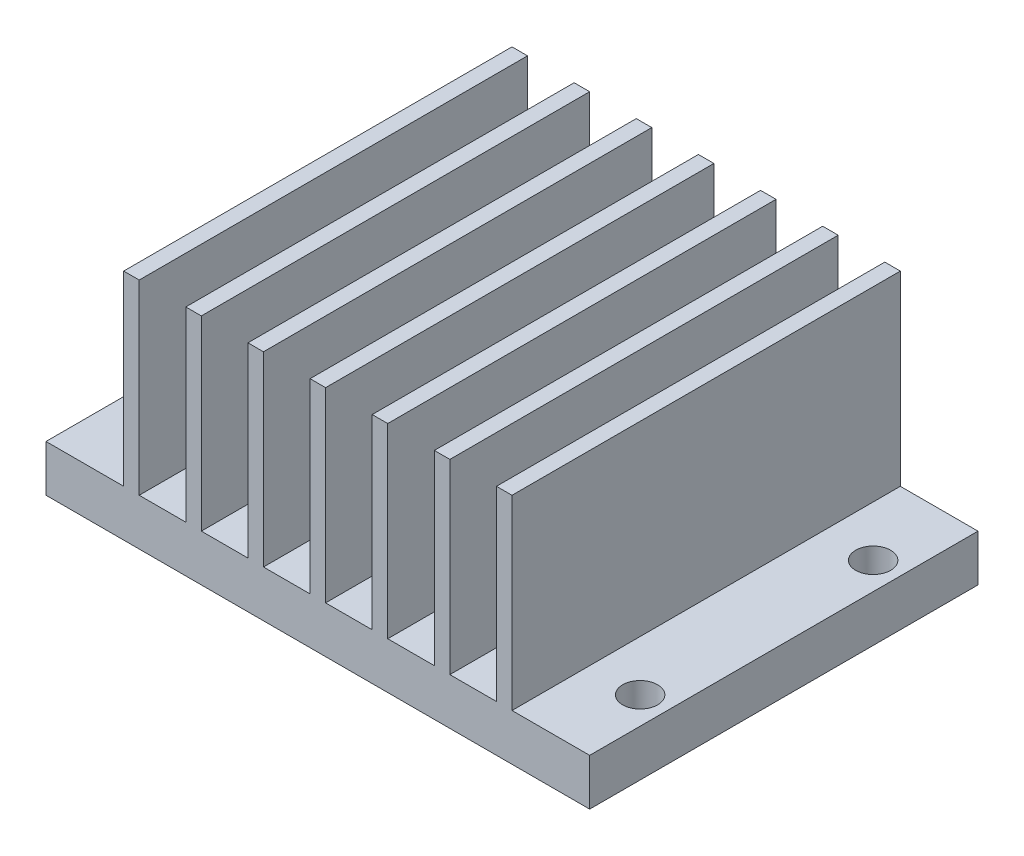
ISO-10303-21;
HEADER;
FILE_DESCRIPTION(('STEP AP214'),'2;1');
FILE_NAME('part.step','',(''),(''),'','','');
FILE_SCHEMA(('AUTOMOTIVE_DESIGN { 1 0 10303 214 1 1 1 1 }'));
ENDSEC;
DATA;
#1=APPLICATION_CONTEXT('core data for automotive mechanical design processes');
#2=APPLICATION_PROTOCOL_DEFINITION('international standard','automotive_design',2000,#1);
#3=PRODUCT_CONTEXT('',#1,'mechanical');
#4=PRODUCT('Part','Part','',(#3));
#5=PRODUCT_RELATED_PRODUCT_CATEGORY('part','',(#4));
#6=PRODUCT_DEFINITION_FORMATION('','',#4);
#7=PRODUCT_DEFINITION_CONTEXT('part definition',#1,'design');
#8=PRODUCT_DEFINITION('design','',#6,#7);
#9=PRODUCT_DEFINITION_SHAPE('','',#8);
#10=(LENGTH_UNIT() NAMED_UNIT(*) SI_UNIT(.MILLI.,.METRE.));
#11=(NAMED_UNIT(*) PLANE_ANGLE_UNIT() SI_UNIT($,.RADIAN.));
#12=(NAMED_UNIT(*) SI_UNIT($,.STERADIAN.) SOLID_ANGLE_UNIT());
#13=UNCERTAINTY_MEASURE_WITH_UNIT(LENGTH_MEASURE(1.E-05),#10,'distance_accuracy_value','');
#14=(GEOMETRIC_REPRESENTATION_CONTEXT(3) GLOBAL_UNCERTAINTY_ASSIGNED_CONTEXT((#13)) GLOBAL_UNIT_ASSIGNED_CONTEXT((#10,
#11,#12)) REPRESENTATION_CONTEXT('',''));
#15=CARTESIAN_POINT('',(0.,0.,0.));
#16=DIRECTION('',(0.,0.,1.));
#17=DIRECTION('',(1.,0.,0.));
#18=AXIS2_PLACEMENT_3D('',#15,#16,#17);
#19=CARTESIAN_POINT('',(0.,6.,0.));
#20=DIRECTION('',(0.,-1.,0.));
#21=DIRECTION('',(0.,0.,-1.));
#22=AXIS2_PLACEMENT_3D('',#19,#20,#21);
#23=PLANE('',#22);
#24=CARTESIAN_POINT('',(-31.5,6.,15.));
#25=DIRECTION('',(0.,-1.,0.));
#26=DIRECTION('',(0.,0.,-1.));
#27=AXIS2_PLACEMENT_3D('',#24,#25,#26);
#28=CIRCLE('',#27,2.25);
#29=CARTESIAN_POINT('',(-31.5,6.,12.75));
#30=VERTEX_POINT('',#29);
#31=EDGE_CURVE('E450',#30,#30,#28,.T.);
#32=ORIENTED_EDGE('',*,*,#31,.T.);
#33=EDGE_LOOP('',(#32));
#34=FACE_BOUND('',#33,.T.);
#35=CARTESIAN_POINT('',(-31.5,6.,-15.));
#36=DIRECTION('',(0.,-1.,0.));
#37=DIRECTION('',(0.,0.,-1.));
#38=AXIS2_PLACEMENT_3D('',#35,#36,#37);
#39=CIRCLE('',#38,2.25);
#40=CARTESIAN_POINT('',(-31.5,6.,-17.25));
#41=VERTEX_POINT('',#40);
#42=EDGE_CURVE('E589',#41,#41,#39,.T.);
#43=ORIENTED_EDGE('',*,*,#42,.T.);
#44=EDGE_LOOP('',(#43));
#45=FACE_BOUND('',#44,.T.);
#46=DIRECTION('',(0.,0.,1.));
#47=VECTOR('',#46,1.);
#48=CARTESIAN_POINT('',(-25.,6.,0.));
#49=LINE('',#48,#47);
#50=CARTESIAN_POINT('',(-25.,6.,-25.));
#51=VERTEX_POINT('',#50);
#52=CARTESIAN_POINT('',(-25.,6.,25.));
#53=VERTEX_POINT('',#52);
#54=EDGE_CURVE('E11',#51,#53,#49,.T.);
#55=ORIENTED_EDGE('',*,*,#54,.F.);
#56=DIRECTION('',(-1.,0.,0.));
#57=VECTOR('',#56,1.);
#58=CARTESIAN_POINT('',(-35.,6.,-25.));
#59=LINE('',#58,#57);
#60=CARTESIAN_POINT('',(-35.,6.,-25.));
#61=VERTEX_POINT('',#60);
#62=EDGE_CURVE('E487',#51,#61,#59,.T.);
#63=ORIENTED_EDGE('',*,*,#62,.T.);
#64=DIRECTION('',(0.,0.,1.));
#65=VECTOR('',#64,1.);
#66=CARTESIAN_POINT('',(-35.,6.,25.));
#67=LINE('',#66,#65);
#68=CARTESIAN_POINT('',(-35.,6.,25.));
#69=VERTEX_POINT('',#68);
#70=EDGE_CURVE('E474',#61,#69,#67,.T.);
#71=ORIENTED_EDGE('',*,*,#70,.T.);
#72=DIRECTION('',(1.,0.,0.));
#73=VECTOR('',#72,1.);
#74=CARTESIAN_POINT('',(35.,6.,25.));
#75=LINE('',#74,#73);
#76=EDGE_CURVE('E480',#69,#53,#75,.T.);
#77=ORIENTED_EDGE('',*,*,#76,.T.);
#78=EDGE_LOOP('',(#55,#63,#71,#77));
#79=FACE_BOUND('',#78,.T.);
#80=ADVANCED_FACE('F51',(#34,#45,#79),#23,.F.);
#81=DIRECTION('',(0.,0.,-1.));
#82=VECTOR('',#81,1.);
#83=CARTESIAN_POINT('',(-23.,6.,0.));
#84=LINE('',#83,#82);
#85=CARTESIAN_POINT('',(-23.,6.,25.));
#86=VERTEX_POINT('',#85);
#87=CARTESIAN_POINT('',(-23.,6.,-25.));
#88=VERTEX_POINT('',#87);
#89=EDGE_CURVE('E60',#86,#88,#84,.T.);
#90=ORIENTED_EDGE('',*,*,#89,.F.);
#91=CARTESIAN_POINT('',(-17.,6.,25.));
#92=VERTEX_POINT('',#91);
#93=EDGE_CURVE('E484',#86,#92,#75,.T.);
#94=ORIENTED_EDGE('',*,*,#93,.T.);
#95=DIRECTION('',(0.,0.,1.));
#96=VECTOR('',#95,1.);
#97=CARTESIAN_POINT('',(-17.,6.,0.));
#98=LINE('',#97,#96);
#99=CARTESIAN_POINT('',(-17.,6.,-25.));
#100=VERTEX_POINT('',#99);
#101=EDGE_CURVE('E558',#100,#92,#98,.T.);
#102=ORIENTED_EDGE('',*,*,#101,.F.);
#103=EDGE_CURVE('E67',#100,#88,#59,.T.);
#104=ORIENTED_EDGE('',*,*,#103,.T.);
#105=EDGE_LOOP('',(#90,#94,#102,#104));
#106=FACE_BOUND('',#105,.T.);
#107=ADVANCED_FACE('F673',(#106),#23,.F.);
#108=DIRECTION('',(0.,0.,-1.));
#109=VECTOR('',#108,1.);
#110=CARTESIAN_POINT('',(-15.,6.,0.));
#111=LINE('',#110,#109);
#112=CARTESIAN_POINT('',(-15.,6.,25.));
#113=VERTEX_POINT('',#112);
#114=CARTESIAN_POINT('',(-15.,6.,-25.));
#115=VERTEX_POINT('',#114);
#116=EDGE_CURVE('E555',#113,#115,#111,.T.);
#117=ORIENTED_EDGE('',*,*,#116,.F.);
#118=CARTESIAN_POINT('',(-9.,6.,25.));
#119=VERTEX_POINT('',#118);
#120=EDGE_CURVE('E665',#113,#119,#75,.T.);
#121=ORIENTED_EDGE('',*,*,#120,.T.);
#122=DIRECTION('',(0.,0.,1.));
#123=VECTOR('',#122,1.);
#124=CARTESIAN_POINT('',(-9.,6.,0.));
#125=LINE('',#124,#123);
#126=CARTESIAN_POINT('',(-9.,6.,-25.));
#127=VERTEX_POINT('',#126);
#128=EDGE_CURVE('E551',#127,#119,#125,.T.);
#129=ORIENTED_EDGE('',*,*,#128,.F.);
#130=EDGE_CURVE('E75',#127,#115,#59,.T.);
#131=ORIENTED_EDGE('',*,*,#130,.T.);
#132=EDGE_LOOP('',(#117,#121,#129,#131));
#133=FACE_BOUND('',#132,.T.);
#134=ADVANCED_FACE('F687',(#133),#23,.F.);
#135=DIRECTION('',(0.,0.,-1.));
#136=VECTOR('',#135,1.);
#137=CARTESIAN_POINT('',(-7.,6.,0.));
#138=LINE('',#137,#136);
#139=CARTESIAN_POINT('',(-7.,6.,25.));
#140=VERTEX_POINT('',#139);
#141=CARTESIAN_POINT('',(-7.,6.,-25.));
#142=VERTEX_POINT('',#141);
#143=EDGE_CURVE('E547',#140,#142,#138,.T.);
#144=ORIENTED_EDGE('',*,*,#143,.F.);
#145=CARTESIAN_POINT('',(-1.,6.,25.));
#146=VERTEX_POINT('',#145);
#147=EDGE_CURVE('E660',#140,#146,#75,.T.);
#148=ORIENTED_EDGE('',*,*,#147,.T.);
#149=DIRECTION('',(0.,0.,1.));
#150=VECTOR('',#149,1.);
#151=CARTESIAN_POINT('',(-1.,6.,0.));
#152=LINE('',#151,#150);
#153=CARTESIAN_POINT('',(-1.,6.,-25.));
#154=VERTEX_POINT('',#153);
#155=EDGE_CURVE('E543',#154,#146,#152,.T.);
#156=ORIENTED_EDGE('',*,*,#155,.F.);
#157=EDGE_CURVE('E701',#154,#142,#59,.T.);
#158=ORIENTED_EDGE('',*,*,#157,.T.);
#159=EDGE_LOOP('',(#144,#148,#156,#158));
#160=FACE_BOUND('',#159,.T.);
#161=ADVANCED_FACE('F700',(#160),#23,.F.);
#162=DIRECTION('',(0.,0.,-1.));
#163=VECTOR('',#162,1.);
#164=CARTESIAN_POINT('',(1.,6.,0.));
#165=LINE('',#164,#163);
#166=CARTESIAN_POINT('',(1.,6.,25.));
#167=VERTEX_POINT('',#166);
#168=CARTESIAN_POINT('',(1.,6.,-25.));
#169=VERTEX_POINT('',#168);
#170=EDGE_CURVE('E539',#167,#169,#165,.T.);
#171=ORIENTED_EDGE('',*,*,#170,.F.);
#172=CARTESIAN_POINT('',(7.,6.,25.));
#173=VERTEX_POINT('',#172);
#174=EDGE_CURVE('E654',#167,#173,#75,.T.);
#175=ORIENTED_EDGE('',*,*,#174,.T.);
#176=DIRECTION('',(0.,0.,1.));
#177=VECTOR('',#176,1.);
#178=CARTESIAN_POINT('',(7.,6.,0.));
#179=LINE('',#178,#177);
#180=CARTESIAN_POINT('',(7.,6.,-25.));
#181=VERTEX_POINT('',#180);
#182=EDGE_CURVE('E535',#181,#173,#179,.T.);
#183=ORIENTED_EDGE('',*,*,#182,.F.);
#184=EDGE_CURVE('E709',#181,#169,#59,.T.);
#185=ORIENTED_EDGE('',*,*,#184,.T.);
#186=EDGE_LOOP('',(#171,#175,#183,#185));
#187=FACE_BOUND('',#186,.T.);
#188=ADVANCED_FACE('F914',(#187),#23,.F.);
#189=DIRECTION('',(0.,0.,-1.));
#190=VECTOR('',#189,1.);
#191=CARTESIAN_POINT('',(9.,6.,0.));
#192=LINE('',#191,#190);
#193=CARTESIAN_POINT('',(9.,6.,25.));
#194=VERTEX_POINT('',#193);
#195=CARTESIAN_POINT('',(9.,6.,-25.));
#196=VERTEX_POINT('',#195);
#197=EDGE_CURVE('E531',#194,#196,#192,.T.);
#198=ORIENTED_EDGE('',*,*,#197,.F.);
#199=CARTESIAN_POINT('',(15.,6.,25.));
#200=VERTEX_POINT('',#199);
#201=EDGE_CURVE('E651',#194,#200,#75,.T.);
#202=ORIENTED_EDGE('',*,*,#201,.T.);
#203=DIRECTION('',(0.,0.,1.));
#204=VECTOR('',#203,1.);
#205=CARTESIAN_POINT('',(15.,6.,0.));
#206=LINE('',#205,#204);
#207=CARTESIAN_POINT('',(15.,6.,-25.));
#208=VERTEX_POINT('',#207);
#209=EDGE_CURVE('E527',#208,#200,#206,.T.);
#210=ORIENTED_EDGE('',*,*,#209,.F.);
#211=EDGE_CURVE('E710',#208,#196,#59,.T.);
#212=ORIENTED_EDGE('',*,*,#211,.T.);
#213=EDGE_LOOP('',(#198,#202,#210,#212));
#214=FACE_BOUND('',#213,.T.);
#215=ADVANCED_FACE('F908',(#214),#23,.F.);
#216=DIRECTION('',(0.,0.,-1.));
#217=VECTOR('',#216,1.);
#218=CARTESIAN_POINT('',(17.,6.,0.));
#219=LINE('',#218,#217);
#220=CARTESIAN_POINT('',(17.,6.,25.));
#221=VERTEX_POINT('',#220);
#222=CARTESIAN_POINT('',(17.,6.,-25.));
#223=VERTEX_POINT('',#222);
#224=EDGE_CURVE('E523',#221,#223,#219,.T.);
#225=ORIENTED_EDGE('',*,*,#224,.F.);
#226=CARTESIAN_POINT('',(23.,6.,25.));
#227=VERTEX_POINT('',#226);
#228=EDGE_CURVE('E636',#221,#227,#75,.T.);
#229=ORIENTED_EDGE('',*,*,#228,.T.);
#230=DIRECTION('',(0.,0.,1.));
#231=VECTOR('',#230,1.);
#232=CARTESIAN_POINT('',(23.,6.,0.));
#233=LINE('',#232,#231);
#234=CARTESIAN_POINT('',(23.,6.,-25.));
#235=VERTEX_POINT('',#234);
#236=EDGE_CURVE('E519',#235,#227,#233,.T.);
#237=ORIENTED_EDGE('',*,*,#236,.F.);
#238=EDGE_CURVE('E491',#235,#223,#59,.T.);
#239=ORIENTED_EDGE('',*,*,#238,.T.);
#240=EDGE_LOOP('',(#225,#229,#237,#239));
#241=FACE_BOUND('',#240,.T.);
#242=ADVANCED_FACE('F624',(#241),#23,.F.);
#243=CARTESIAN_POINT('',(31.5,6.,-15.));
#244=DIRECTION('',(0.,-1.,0.));
#245=DIRECTION('',(0.,0.,-1.));
#246=AXIS2_PLACEMENT_3D('',#243,#244,#245);
#247=CIRCLE('',#246,2.25);
#248=CARTESIAN_POINT('',(31.5,6.,-17.25));
#249=VERTEX_POINT('',#248);
#250=EDGE_CURVE('E581',#249,#249,#247,.T.);
#251=ORIENTED_EDGE('',*,*,#250,.T.);
#252=EDGE_LOOP('',(#251));
#253=FACE_BOUND('',#252,.T.);
#254=CARTESIAN_POINT('',(31.5,6.,15.));
#255=DIRECTION('',(0.,-1.,0.));
#256=DIRECTION('',(0.,0.,-1.));
#257=AXIS2_PLACEMENT_3D('',#254,#255,#256);
#258=CIRCLE('',#257,2.25);
#259=CARTESIAN_POINT('',(31.5,6.,12.75));
#260=VERTEX_POINT('',#259);
#261=EDGE_CURVE('E585',#260,#260,#258,.T.);
#262=ORIENTED_EDGE('',*,*,#261,.T.);
#263=EDGE_LOOP('',(#262));
#264=FACE_BOUND('',#263,.T.);
#265=DIRECTION('',(0.,0.,-1.));
#266=VECTOR('',#265,1.);
#267=CARTESIAN_POINT('',(25.,6.,0.));
#268=LINE('',#267,#266);
#269=CARTESIAN_POINT('',(25.,6.,25.));
#270=VERTEX_POINT('',#269);
#271=CARTESIAN_POINT('',(25.,6.,-25.));
#272=VERTEX_POINT('',#271);
#273=EDGE_CURVE('E515',#270,#272,#268,.T.);
#274=ORIENTED_EDGE('',*,*,#273,.F.);
#275=CARTESIAN_POINT('',(35.,6.,25.));
#276=VERTEX_POINT('',#275);
#277=EDGE_CURVE('E478',#270,#276,#75,.T.);
#278=ORIENTED_EDGE('',*,*,#277,.T.);
#279=DIRECTION('',(0.,0.,-1.));
#280=VECTOR('',#279,1.);
#281=CARTESIAN_POINT('',(35.,6.,-25.));
#282=LINE('',#281,#280);
#283=CARTESIAN_POINT('',(35.,6.,-25.));
#284=VERTEX_POINT('',#283);
#285=EDGE_CURVE('E483',#276,#284,#282,.T.);
#286=ORIENTED_EDGE('',*,*,#285,.T.);
#287=EDGE_CURVE('E488',#284,#272,#59,.T.);
#288=ORIENTED_EDGE('',*,*,#287,.T.);
#289=EDGE_LOOP('',(#274,#278,#286,#288));
#290=FACE_BOUND('',#289,.T.);
#291=ADVANCED_FACE('F621',(#253,#264,#290),#23,.F.);
#292=CARTESIAN_POINT('',(-35.,6.,25.));
#293=DIRECTION('',(1.,0.,0.));
#294=DIRECTION('',(0.,0.,-1.));
#295=AXIS2_PLACEMENT_3D('',#292,#293,#294);
#296=PLANE('',#295);
#297=DIRECTION('',(0.,0.,1.));
#298=VECTOR('',#297,1.);
#299=CARTESIAN_POINT('',(-35.,0.,25.));
#300=LINE('',#299,#298);
#301=CARTESIAN_POINT('',(-35.,0.,-25.));
#302=VERTEX_POINT('',#301);
#303=CARTESIAN_POINT('',(-35.,0.,25.));
#304=VERTEX_POINT('',#303);
#305=EDGE_CURVE('E288',#302,#304,#300,.T.);
#306=ORIENTED_EDGE('',*,*,#305,.T.);
#307=DIRECTION('',(0.,-1.,0.));
#308=VECTOR('',#307,1.);
#309=CARTESIAN_POINT('',(-35.,6.,25.));
#310=LINE('',#309,#308);
#311=EDGE_CURVE('E511',#69,#304,#310,.T.);
#312=ORIENTED_EDGE('',*,*,#311,.F.);
#313=ORIENTED_EDGE('',*,*,#70,.F.);
#314=DIRECTION('',(0.,-1.,0.));
#315=VECTOR('',#314,1.);
#316=CARTESIAN_POINT('',(-35.,6.,-25.));
#317=LINE('',#316,#315);
#318=EDGE_CURVE('E490',#61,#302,#317,.T.);
#319=ORIENTED_EDGE('',*,*,#318,.T.);
#320=EDGE_LOOP('',(#306,#312,#313,#319));
#321=FACE_BOUND('',#320,.T.);
#322=ADVANCED_FACE('F53',(#321),#296,.F.);
#323=CARTESIAN_POINT('',(35.,6.,25.));
#324=DIRECTION('',(0.,0.,-1.));
#325=DIRECTION('',(-1.,0.,0.));
#326=AXIS2_PLACEMENT_3D('',#323,#324,#325);
#327=PLANE('',#326);
#328=ORIENTED_EDGE('',*,*,#93,.F.);
#329=DIRECTION('',(0.,-1.,0.));
#330=VECTOR('',#329,1.);
#331=CARTESIAN_POINT('',(-23.,30.,25.));
#332=LINE('',#331,#330);
#333=CARTESIAN_POINT('',(-23.,30.,25.));
#334=VERTEX_POINT('',#333);
#335=EDGE_CURVE('E268',#334,#86,#332,.T.);
#336=ORIENTED_EDGE('',*,*,#335,.F.);
#337=DIRECTION('',(1.,0.,0.));
#338=VECTOR('',#337,1.);
#339=CARTESIAN_POINT('',(-23.,30.,25.));
#340=LINE('',#339,#338);
#341=CARTESIAN_POINT('',(-25.,30.,25.));
#342=VERTEX_POINT('',#341);
#343=EDGE_CURVE('E261',#342,#334,#340,.T.);
#344=ORIENTED_EDGE('',*,*,#343,.F.);
#345=DIRECTION('',(0.,-1.,0.));
#346=VECTOR('',#345,1.);
#347=CARTESIAN_POINT('',(-25.,30.,25.));
#348=LINE('',#347,#346);
#349=EDGE_CURVE('E266',#342,#53,#348,.T.);
#350=ORIENTED_EDGE('',*,*,#349,.T.);
#351=ORIENTED_EDGE('',*,*,#76,.F.);
#352=ORIENTED_EDGE('',*,*,#311,.T.);
#353=DIRECTION('',(1.,0.,0.));
#354=VECTOR('',#353,1.);
#355=CARTESIAN_POINT('',(35.,0.,25.));
#356=LINE('',#355,#354);
#357=CARTESIAN_POINT('',(35.,0.,25.));
#358=VERTEX_POINT('',#357);
#359=EDGE_CURVE('E294',#304,#358,#356,.T.);
#360=ORIENTED_EDGE('',*,*,#359,.T.);
#361=DIRECTION('',(0.,-1.,0.));
#362=VECTOR('',#361,1.);
#363=CARTESIAN_POINT('',(35.,6.,25.));
#364=LINE('',#363,#362);
#365=EDGE_CURVE('E507',#276,#358,#364,.T.);
#366=ORIENTED_EDGE('',*,*,#365,.F.);
#367=ORIENTED_EDGE('',*,*,#277,.F.);
#368=DIRECTION('',(0.,-1.,0.));
#369=VECTOR('',#368,1.);
#370=CARTESIAN_POINT('',(25.,30.,25.));
#371=LINE('',#370,#369);
#372=CARTESIAN_POINT('',(25.,30.,25.));
#373=VERTEX_POINT('',#372);
#374=EDGE_CURVE('E449',#373,#270,#371,.T.);
#375=ORIENTED_EDGE('',*,*,#374,.F.);
#376=DIRECTION('',(1.,0.,0.));
#377=VECTOR('',#376,1.);
#378=CARTESIAN_POINT('',(25.,30.,25.));
#379=LINE('',#378,#377);
#380=CARTESIAN_POINT('',(23.,30.,25.));
#381=VERTEX_POINT('',#380);
#382=EDGE_CURVE('E468',#381,#373,#379,.T.);
#383=ORIENTED_EDGE('',*,*,#382,.F.);
#384=DIRECTION('',(0.,-1.,0.));
#385=VECTOR('',#384,1.);
#386=CARTESIAN_POINT('',(23.,30.,25.));
#387=LINE('',#386,#385);
#388=EDGE_CURVE('E445',#381,#227,#387,.T.);
#389=ORIENTED_EDGE('',*,*,#388,.T.);
#390=ORIENTED_EDGE('',*,*,#228,.F.);
#391=DIRECTION('',(0.,-1.,0.));
#392=VECTOR('',#391,1.);
#393=CARTESIAN_POINT('',(17.,30.,25.));
#394=LINE('',#393,#392);
#395=CARTESIAN_POINT('',(17.,30.,25.));
#396=VERTEX_POINT('',#395);
#397=EDGE_CURVE('E420',#396,#221,#394,.T.);
#398=ORIENTED_EDGE('',*,*,#397,.F.);
#399=DIRECTION('',(1.,0.,0.));
#400=VECTOR('',#399,1.);
#401=CARTESIAN_POINT('',(17.,30.,25.));
#402=LINE('',#401,#400);
#403=CARTESIAN_POINT('',(15.,30.,25.));
#404=VERTEX_POINT('',#403);
#405=EDGE_CURVE('E439',#404,#396,#402,.T.);
#406=ORIENTED_EDGE('',*,*,#405,.F.);
#407=DIRECTION('',(0.,-1.,0.));
#408=VECTOR('',#407,1.);
#409=CARTESIAN_POINT('',(15.,30.,25.));
#410=LINE('',#409,#408);
#411=EDGE_CURVE('E416',#404,#200,#410,.T.);
#412=ORIENTED_EDGE('',*,*,#411,.T.);
#413=ORIENTED_EDGE('',*,*,#201,.F.);
#414=DIRECTION('',(0.,-1.,0.));
#415=VECTOR('',#414,1.);
#416=CARTESIAN_POINT('',(9.,30.,25.));
#417=LINE('',#416,#415);
#418=CARTESIAN_POINT('',(9.,30.,25.));
#419=VERTEX_POINT('',#418);
#420=EDGE_CURVE('E391',#419,#194,#417,.T.);
#421=ORIENTED_EDGE('',*,*,#420,.F.);
#422=DIRECTION('',(1.,0.,0.));
#423=VECTOR('',#422,1.);
#424=CARTESIAN_POINT('',(9.,30.,25.));
#425=LINE('',#424,#423);
#426=CARTESIAN_POINT('',(7.,30.,25.));
#427=VERTEX_POINT('',#426);
#428=EDGE_CURVE('E410',#427,#419,#425,.T.);
#429=ORIENTED_EDGE('',*,*,#428,.F.);
#430=DIRECTION('',(0.,-1.,0.));
#431=VECTOR('',#430,1.);
#432=CARTESIAN_POINT('',(7.,30.,25.));
#433=LINE('',#432,#431);
#434=EDGE_CURVE('E387',#427,#173,#433,.T.);
#435=ORIENTED_EDGE('',*,*,#434,.T.);
#436=ORIENTED_EDGE('',*,*,#174,.F.);
#437=DIRECTION('',(0.,-1.,0.));
#438=VECTOR('',#437,1.);
#439=CARTESIAN_POINT('',(1.,30.,25.));
#440=LINE('',#439,#438);
#441=CARTESIAN_POINT('',(1.,30.,25.));
#442=VERTEX_POINT('',#441);
#443=EDGE_CURVE('E362',#442,#167,#440,.T.);
#444=ORIENTED_EDGE('',*,*,#443,.F.);
#445=DIRECTION('',(1.,0.,0.));
#446=VECTOR('',#445,1.);
#447=CARTESIAN_POINT('',(1.,30.,25.));
#448=LINE('',#447,#446);
#449=CARTESIAN_POINT('',(-1.,30.,25.));
#450=VERTEX_POINT('',#449);
#451=EDGE_CURVE('E381',#450,#442,#448,.T.);
#452=ORIENTED_EDGE('',*,*,#451,.F.);
#453=DIRECTION('',(0.,-1.,0.));
#454=VECTOR('',#453,1.);
#455=CARTESIAN_POINT('',(-1.,30.,25.));
#456=LINE('',#455,#454);
#457=EDGE_CURVE('E358',#450,#146,#456,.T.);
#458=ORIENTED_EDGE('',*,*,#457,.T.);
#459=ORIENTED_EDGE('',*,*,#147,.F.);
#460=DIRECTION('',(0.,-1.,0.));
#461=VECTOR('',#460,1.);
#462=CARTESIAN_POINT('',(-7.,30.,25.));
#463=LINE('',#462,#461);
#464=CARTESIAN_POINT('',(-7.,30.,25.));
#465=VERTEX_POINT('',#464);
#466=EDGE_CURVE('E334',#465,#140,#463,.T.);
#467=ORIENTED_EDGE('',*,*,#466,.F.);
#468=DIRECTION('',(1.,0.,0.));
#469=VECTOR('',#468,1.);
#470=CARTESIAN_POINT('',(-7.,30.,25.));
#471=LINE('',#470,#469);
#472=CARTESIAN_POINT('',(-9.,30.,25.));
#473=VERTEX_POINT('',#472);
#474=EDGE_CURVE('E352',#473,#465,#471,.T.);
#475=ORIENTED_EDGE('',*,*,#474,.F.);
#476=DIRECTION('',(0.,-1.,0.));
#477=VECTOR('',#476,1.);
#478=CARTESIAN_POINT('',(-9.,30.,25.));
#479=LINE('',#478,#477);
#480=EDGE_CURVE('E330',#473,#119,#479,.T.);
#481=ORIENTED_EDGE('',*,*,#480,.T.);
#482=ORIENTED_EDGE('',*,*,#120,.F.);
#483=DIRECTION('',(0.,-1.,0.));
#484=VECTOR('',#483,1.);
#485=CARTESIAN_POINT('',(-15.,30.,25.));
#486=LINE('',#485,#484);
#487=CARTESIAN_POINT('',(-15.,30.,25.));
#488=VERTEX_POINT('',#487);
#489=EDGE_CURVE('E305',#488,#113,#486,.T.);
#490=ORIENTED_EDGE('',*,*,#489,.F.);
#491=DIRECTION('',(1.,0.,0.));
#492=VECTOR('',#491,1.);
#493=CARTESIAN_POINT('',(-15.,30.,25.));
#494=LINE('',#493,#492);
#495=CARTESIAN_POINT('',(-17.,30.,25.));
#496=VERTEX_POINT('',#495);
#497=EDGE_CURVE('E324',#496,#488,#494,.T.);
#498=ORIENTED_EDGE('',*,*,#497,.F.);
#499=DIRECTION('',(0.,-1.,0.));
#500=VECTOR('',#499,1.);
#501=CARTESIAN_POINT('',(-17.,30.,25.));
#502=LINE('',#501,#500);
#503=EDGE_CURVE('E301',#496,#92,#502,.T.);
#504=ORIENTED_EDGE('',*,*,#503,.T.);
#505=EDGE_LOOP('',(#328,#336,#344,#350,#351,#352,#360,#366,#367,#375,#383,#389,#390,#398,#406,
#412,#413,#421,#429,#435,#436,#444,#452,#458,#459,#467,#475,#481,#482,#490,#498,#504));
#506=FACE_BOUND('',#505,.T.);
#507=ADVANCED_FACE('F264',(#506),#327,.F.);
#508=CARTESIAN_POINT('',(35.,6.,-25.));
#509=DIRECTION('',(-1.,0.,0.));
#510=DIRECTION('',(0.,0.,1.));
#511=AXIS2_PLACEMENT_3D('',#508,#509,#510);
#512=PLANE('',#511);
#513=DIRECTION('',(0.,0.,-1.));
#514=VECTOR('',#513,1.);
#515=CARTESIAN_POINT('',(35.,0.,-25.));
#516=LINE('',#515,#514);
#517=CARTESIAN_POINT('',(35.,0.,-25.));
#518=VERTEX_POINT('',#517);
#519=EDGE_CURVE('E495',#358,#518,#516,.T.);
#520=ORIENTED_EDGE('',*,*,#519,.T.);
#521=DIRECTION('',(0.,-1.,0.));
#522=VECTOR('',#521,1.);
#523=CARTESIAN_POINT('',(35.,6.,-25.));
#524=LINE('',#523,#522);
#525=EDGE_CURVE('E503',#284,#518,#524,.T.);
#526=ORIENTED_EDGE('',*,*,#525,.F.);
#527=ORIENTED_EDGE('',*,*,#285,.F.);
#528=ORIENTED_EDGE('',*,*,#365,.T.);
#529=EDGE_LOOP('',(#520,#526,#527,#528));
#530=FACE_BOUND('',#529,.T.);
#531=ADVANCED_FACE('F723',(#530),#512,.F.);
#532=CARTESIAN_POINT('',(-35.,6.,-25.));
#533=DIRECTION('',(0.,0.,1.));
#534=DIRECTION('',(1.,0.,0.));
#535=AXIS2_PLACEMENT_3D('',#532,#533,#534);
#536=PLANE('',#535);
#537=ORIENTED_EDGE('',*,*,#62,.F.);
#538=DIRECTION('',(0.,-1.,0.));
#539=VECTOR('',#538,1.);
#540=CARTESIAN_POINT('',(-25.,30.,-25.));
#541=LINE('',#540,#539);
#542=CARTESIAN_POINT('',(-25.,30.,-25.));
#543=VERTEX_POINT('',#542);
#544=EDGE_CURVE('E570',#543,#51,#541,.T.);
#545=ORIENTED_EDGE('',*,*,#544,.F.);
#546=DIRECTION('',(-1.,0.,0.));
#547=VECTOR('',#546,1.);
#548=CARTESIAN_POINT('',(-25.,30.,-25.));
#549=LINE('',#548,#547);
#550=CARTESIAN_POINT('',(-23.,30.,-25.));
#551=VERTEX_POINT('',#550);
#552=EDGE_CURVE('E278',#551,#543,#549,.T.);
#553=ORIENTED_EDGE('',*,*,#552,.F.);
#554=DIRECTION('',(0.,-1.,0.));
#555=VECTOR('',#554,1.);
#556=CARTESIAN_POINT('',(-23.,30.,-25.));
#557=LINE('',#556,#555);
#558=EDGE_CURVE('E297',#551,#88,#557,.T.);
#559=ORIENTED_EDGE('',*,*,#558,.T.);
#560=ORIENTED_EDGE('',*,*,#103,.F.);
#561=DIRECTION('',(0.,-1.,0.));
#562=VECTOR('',#561,1.);
#563=CARTESIAN_POINT('',(-17.,30.,-25.));
#564=LINE('',#563,#562);
#565=CARTESIAN_POINT('',(-17.,30.,-25.));
#566=VERTEX_POINT('',#565);
#567=EDGE_CURVE('E314',#566,#100,#564,.T.);
#568=ORIENTED_EDGE('',*,*,#567,.F.);
#569=DIRECTION('',(-1.,0.,0.));
#570=VECTOR('',#569,1.);
#571=CARTESIAN_POINT('',(-17.,30.,-25.));
#572=LINE('',#571,#570);
#573=CARTESIAN_POINT('',(-15.,30.,-25.));
#574=VERTEX_POINT('',#573);
#575=EDGE_CURVE('E318',#574,#566,#572,.T.);
#576=ORIENTED_EDGE('',*,*,#575,.F.);
#577=DIRECTION('',(0.,-1.,0.));
#578=VECTOR('',#577,1.);
#579=CARTESIAN_POINT('',(-15.,30.,-25.));
#580=LINE('',#579,#578);
#581=EDGE_CURVE('E310',#574,#115,#580,.T.);
#582=ORIENTED_EDGE('',*,*,#581,.T.);
#583=ORIENTED_EDGE('',*,*,#130,.F.);
#584=DIRECTION('',(0.,-1.,0.));
#585=VECTOR('',#584,1.);
#586=CARTESIAN_POINT('',(-9.,30.,-25.));
#587=LINE('',#586,#585);
#588=CARTESIAN_POINT('',(-9.,30.,-25.));
#589=VERTEX_POINT('',#588);
#590=EDGE_CURVE('E342',#589,#127,#587,.T.);
#591=ORIENTED_EDGE('',*,*,#590,.F.);
#592=DIRECTION('',(-1.,0.,0.));
#593=VECTOR('',#592,1.);
#594=CARTESIAN_POINT('',(-9.,30.,-25.));
#595=LINE('',#594,#593);
#596=CARTESIAN_POINT('',(-7.,30.,-25.));
#597=VERTEX_POINT('',#596);
#598=EDGE_CURVE('E346',#597,#589,#595,.T.);
#599=ORIENTED_EDGE('',*,*,#598,.F.);
#600=DIRECTION('',(0.,-1.,0.));
#601=VECTOR('',#600,1.);
#602=CARTESIAN_POINT('',(-7.,30.,-25.));
#603=LINE('',#602,#601);
#604=EDGE_CURVE('E338',#597,#142,#603,.T.);
#605=ORIENTED_EDGE('',*,*,#604,.T.);
#606=ORIENTED_EDGE('',*,*,#157,.F.);
#607=DIRECTION('',(0.,-1.,0.));
#608=VECTOR('',#607,1.);
#609=CARTESIAN_POINT('',(-1.,30.,-25.));
#610=LINE('',#609,#608);
#611=CARTESIAN_POINT('',(-1.,30.,-25.));
#612=VERTEX_POINT('',#611);
#613=EDGE_CURVE('E371',#612,#154,#610,.T.);
#614=ORIENTED_EDGE('',*,*,#613,.F.);
#615=DIRECTION('',(-1.,0.,0.));
#616=VECTOR('',#615,1.);
#617=CARTESIAN_POINT('',(-1.,30.,-25.));
#618=LINE('',#617,#616);
#619=CARTESIAN_POINT('',(1.,30.,-25.));
#620=VERTEX_POINT('',#619);
#621=EDGE_CURVE('E375',#620,#612,#618,.T.);
#622=ORIENTED_EDGE('',*,*,#621,.F.);
#623=DIRECTION('',(0.,-1.,0.));
#624=VECTOR('',#623,1.);
#625=CARTESIAN_POINT('',(1.,30.,-25.));
#626=LINE('',#625,#624);
#627=EDGE_CURVE('E367',#620,#169,#626,.T.);
#628=ORIENTED_EDGE('',*,*,#627,.T.);
#629=ORIENTED_EDGE('',*,*,#184,.F.);
#630=DIRECTION('',(0.,-1.,0.));
#631=VECTOR('',#630,1.);
#632=CARTESIAN_POINT('',(7.,30.,-25.));
#633=LINE('',#632,#631);
#634=CARTESIAN_POINT('',(7.,30.,-25.));
#635=VERTEX_POINT('',#634);
#636=EDGE_CURVE('E400',#635,#181,#633,.T.);
#637=ORIENTED_EDGE('',*,*,#636,.F.);
#638=DIRECTION('',(-1.,0.,0.));
#639=VECTOR('',#638,1.);
#640=CARTESIAN_POINT('',(7.,30.,-25.));
#641=LINE('',#640,#639);
#642=CARTESIAN_POINT('',(9.,30.,-25.));
#643=VERTEX_POINT('',#642);
#644=EDGE_CURVE('E404',#643,#635,#641,.T.);
#645=ORIENTED_EDGE('',*,*,#644,.F.);
#646=DIRECTION('',(0.,-1.,0.));
#647=VECTOR('',#646,1.);
#648=CARTESIAN_POINT('',(9.,30.,-25.));
#649=LINE('',#648,#647);
#650=EDGE_CURVE('E396',#643,#196,#649,.T.);
#651=ORIENTED_EDGE('',*,*,#650,.T.);
#652=ORIENTED_EDGE('',*,*,#211,.F.);
#653=DIRECTION('',(0.,-1.,0.));
#654=VECTOR('',#653,1.);
#655=CARTESIAN_POINT('',(15.,30.,-25.));
#656=LINE('',#655,#654);
#657=CARTESIAN_POINT('',(15.,30.,-25.));
#658=VERTEX_POINT('',#657);
#659=EDGE_CURVE('E429',#658,#208,#656,.T.);
#660=ORIENTED_EDGE('',*,*,#659,.F.);
#661=DIRECTION('',(-1.,0.,0.));
#662=VECTOR('',#661,1.);
#663=CARTESIAN_POINT('',(15.,30.,-25.));
#664=LINE('',#663,#662);
#665=CARTESIAN_POINT('',(17.,30.,-25.));
#666=VERTEX_POINT('',#665);
#667=EDGE_CURVE('E433',#666,#658,#664,.T.);
#668=ORIENTED_EDGE('',*,*,#667,.F.);
#669=DIRECTION('',(0.,-1.,0.));
#670=VECTOR('',#669,1.);
#671=CARTESIAN_POINT('',(17.,30.,-25.));
#672=LINE('',#671,#670);
#673=EDGE_CURVE('E425',#666,#223,#672,.T.);
#674=ORIENTED_EDGE('',*,*,#673,.T.);
#675=ORIENTED_EDGE('',*,*,#238,.F.);
#676=DIRECTION('',(0.,-1.,0.));
#677=VECTOR('',#676,1.);
#678=CARTESIAN_POINT('',(23.,30.,-25.));
#679=LINE('',#678,#677);
#680=CARTESIAN_POINT('',(23.,30.,-25.));
#681=VERTEX_POINT('',#680);
#682=EDGE_CURVE('E458',#681,#235,#679,.T.);
#683=ORIENTED_EDGE('',*,*,#682,.F.);
#684=DIRECTION('',(-1.,0.,0.));
#685=VECTOR('',#684,1.);
#686=CARTESIAN_POINT('',(23.,30.,-25.));
#687=LINE('',#686,#685);
#688=CARTESIAN_POINT('',(25.,30.,-25.));
#689=VERTEX_POINT('',#688);
#690=EDGE_CURVE('E462',#689,#681,#687,.T.);
#691=ORIENTED_EDGE('',*,*,#690,.F.);
#692=DIRECTION('',(0.,-1.,0.));
#693=VECTOR('',#692,1.);
#694=CARTESIAN_POINT('',(25.,30.,-25.));
#695=LINE('',#694,#693);
#696=EDGE_CURVE('E454',#689,#272,#695,.T.);
#697=ORIENTED_EDGE('',*,*,#696,.T.);
#698=ORIENTED_EDGE('',*,*,#287,.F.);
#699=ORIENTED_EDGE('',*,*,#525,.T.);
#700=DIRECTION('',(-1.,0.,0.));
#701=VECTOR('',#700,1.);
#702=CARTESIAN_POINT('',(-35.,0.,-25.));
#703=LINE('',#702,#701);
#704=EDGE_CURVE('E479',#518,#302,#703,.T.);
#705=ORIENTED_EDGE('',*,*,#704,.T.);
#706=ORIENTED_EDGE('',*,*,#318,.F.);
#707=EDGE_LOOP('',(#537,#545,#553,#559,#560,#568,#576,#582,#583,#591,#599,#605,#606,#614,#622,
#628,#629,#637,#645,#651,#652,#660,#668,#674,#675,#683,#691,#697,#698,#699,#705,#706));
#708=FACE_BOUND('',#707,.T.);
#709=ADVANCED_FACE('F567',(#708),#536,.F.);
#710=CARTESIAN_POINT('',(0.,0.,0.));
#711=DIRECTION('',(0.,-1.,0.));
#712=DIRECTION('',(0.,0.,-1.));
#713=AXIS2_PLACEMENT_3D('',#710,#711,#712);
#714=PLANE('',#713);
#715=CARTESIAN_POINT('',(-31.5,0.,15.));
#716=DIRECTION('',(0.,1.,0.));
#717=DIRECTION('',(0.,0.,1.));
#718=AXIS2_PLACEMENT_3D('',#715,#716,#717);
#719=CIRCLE('',#718,2.25);
#720=CARTESIAN_POINT('',(-31.5,0.,17.25));
#721=VERTEX_POINT('',#720);
#722=EDGE_CURVE('E597',#721,#721,#719,.T.);
#723=ORIENTED_EDGE('',*,*,#722,.T.);
#724=EDGE_LOOP('',(#723));
#725=FACE_BOUND('',#724,.T.);
#726=CARTESIAN_POINT('',(31.5,0.,-15.));
#727=DIRECTION('',(0.,1.,0.));
#728=DIRECTION('',(0.,0.,1.));
#729=AXIS2_PLACEMENT_3D('',#726,#727,#728);
#730=CIRCLE('',#729,2.25);
#731=CARTESIAN_POINT('',(31.5,0.,-12.75));
#732=VERTEX_POINT('',#731);
#733=EDGE_CURVE('E598',#732,#732,#730,.T.);
#734=ORIENTED_EDGE('',*,*,#733,.T.);
#735=EDGE_LOOP('',(#734));
#736=FACE_BOUND('',#735,.T.);
#737=CARTESIAN_POINT('',(31.5,0.,15.));
#738=DIRECTION('',(0.,1.,0.));
#739=DIRECTION('',(0.,0.,1.));
#740=AXIS2_PLACEMENT_3D('',#737,#738,#739);
#741=CIRCLE('',#740,2.25);
#742=CARTESIAN_POINT('',(31.5,0.,17.25));
#743=VERTEX_POINT('',#742);
#744=EDGE_CURVE('E602',#743,#743,#741,.T.);
#745=ORIENTED_EDGE('',*,*,#744,.T.);
#746=EDGE_LOOP('',(#745));
#747=FACE_BOUND('',#746,.T.);
#748=CARTESIAN_POINT('',(-31.5,0.,-15.));
#749=DIRECTION('',(0.,1.,0.));
#750=DIRECTION('',(0.,0.,1.));
#751=AXIS2_PLACEMENT_3D('',#748,#749,#750);
#752=CIRCLE('',#751,2.25);
#753=CARTESIAN_POINT('',(-31.5,0.,-12.75));
#754=VERTEX_POINT('',#753);
#755=EDGE_CURVE('E593',#754,#754,#752,.T.);
#756=ORIENTED_EDGE('',*,*,#755,.T.);
#757=EDGE_LOOP('',(#756));
#758=FACE_BOUND('',#757,.T.);
#759=ORIENTED_EDGE('',*,*,#305,.F.);
#760=ORIENTED_EDGE('',*,*,#704,.F.);
#761=ORIENTED_EDGE('',*,*,#519,.F.);
#762=ORIENTED_EDGE('',*,*,#359,.F.);
#763=EDGE_LOOP('',(#759,#760,#761,#762));
#764=FACE_BOUND('',#763,.T.);
#765=ADVANCED_FACE('F610',(#725,#736,#747,#758,#764),#714,.T.);
#766=CARTESIAN_POINT('',(23.,30.,25.));
#767=DIRECTION('',(1.,0.,0.));
#768=DIRECTION('',(0.,0.,-1.));
#769=AXIS2_PLACEMENT_3D('',#766,#767,#768);
#770=PLANE('',#769);
#771=ORIENTED_EDGE('',*,*,#682,.T.);
#772=ORIENTED_EDGE('',*,*,#236,.T.);
#773=ORIENTED_EDGE('',*,*,#388,.F.);
#774=DIRECTION('',(0.,0.,1.));
#775=VECTOR('',#774,1.);
#776=CARTESIAN_POINT('',(23.,30.,25.));
#777=LINE('',#776,#775);
#778=EDGE_CURVE('E421',#681,#381,#777,.T.);
#779=ORIENTED_EDGE('',*,*,#778,.F.);
#780=EDGE_LOOP('',(#771,#772,#773,#779));
#781=FACE_BOUND('',#780,.T.);
#782=ADVANCED_FACE('F647',(#781),#770,.F.);
#783=CARTESIAN_POINT('',(25.,30.,-25.));
#784=DIRECTION('',(-1.,0.,0.));
#785=DIRECTION('',(0.,0.,1.));
#786=AXIS2_PLACEMENT_3D('',#783,#784,#785);
#787=PLANE('',#786);
#788=ORIENTED_EDGE('',*,*,#374,.T.);
#789=ORIENTED_EDGE('',*,*,#273,.T.);
#790=ORIENTED_EDGE('',*,*,#696,.F.);
#791=DIRECTION('',(0.,0.,-1.));
#792=VECTOR('',#791,1.);
#793=CARTESIAN_POINT('',(25.,30.,-25.));
#794=LINE('',#793,#792);
#795=EDGE_CURVE('E465',#373,#689,#794,.T.);
#796=ORIENTED_EDGE('',*,*,#795,.F.);
#797=EDGE_LOOP('',(#788,#789,#790,#796));
#798=FACE_BOUND('',#797,.T.);
#799=ADVANCED_FACE('F637',(#798),#787,.F.);
#800=CARTESIAN_POINT('',(0.,30.,0.));
#801=DIRECTION('',(0.,-1.,0.));
#802=DIRECTION('',(0.,0.,-1.));
#803=AXIS2_PLACEMENT_3D('',#800,#801,#802);
#804=PLANE('',#803);
#805=ORIENTED_EDGE('',*,*,#778,.T.);
#806=ORIENTED_EDGE('',*,*,#382,.T.);
#807=ORIENTED_EDGE('',*,*,#795,.T.);
#808=ORIENTED_EDGE('',*,*,#690,.T.);
#809=EDGE_LOOP('',(#805,#806,#807,#808));
#810=FACE_BOUND('',#809,.T.);
#811=ADVANCED_FACE('F640',(#810),#804,.F.);
#812=CARTESIAN_POINT('',(15.,30.,25.));
#813=DIRECTION('',(1.,0.,0.));
#814=DIRECTION('',(0.,0.,-1.));
#815=AXIS2_PLACEMENT_3D('',#812,#813,#814);
#816=PLANE('',#815);
#817=ORIENTED_EDGE('',*,*,#659,.T.);
#818=ORIENTED_EDGE('',*,*,#209,.T.);
#819=ORIENTED_EDGE('',*,*,#411,.F.);
#820=DIRECTION('',(0.,0.,1.));
#821=VECTOR('',#820,1.);
#822=CARTESIAN_POINT('',(15.,30.,25.));
#823=LINE('',#822,#821);
#824=EDGE_CURVE('E392',#658,#404,#823,.T.);
#825=ORIENTED_EDGE('',*,*,#824,.F.);
#826=EDGE_LOOP('',(#817,#818,#819,#825));
#827=FACE_BOUND('',#826,.T.);
#828=ADVANCED_FACE('F742',(#827),#816,.F.);
#829=CARTESIAN_POINT('',(17.,30.,-25.));
#830=DIRECTION('',(-1.,0.,0.));
#831=DIRECTION('',(0.,0.,1.));
#832=AXIS2_PLACEMENT_3D('',#829,#830,#831);
#833=PLANE('',#832);
#834=ORIENTED_EDGE('',*,*,#397,.T.);
#835=ORIENTED_EDGE('',*,*,#224,.T.);
#836=ORIENTED_EDGE('',*,*,#673,.F.);
#837=DIRECTION('',(0.,0.,-1.));
#838=VECTOR('',#837,1.);
#839=CARTESIAN_POINT('',(17.,30.,-25.));
#840=LINE('',#839,#838);
#841=EDGE_CURVE('E436',#396,#666,#840,.T.);
#842=ORIENTED_EDGE('',*,*,#841,.F.);
#843=EDGE_LOOP('',(#834,#835,#836,#842));
#844=FACE_BOUND('',#843,.T.);
#845=ADVANCED_FACE('F749',(#844),#833,.F.);
#846=CARTESIAN_POINT('',(0.,30.,0.));
#847=DIRECTION('',(0.,-1.,0.));
#848=DIRECTION('',(0.,0.,-1.));
#849=AXIS2_PLACEMENT_3D('',#846,#847,#848);
#850=PLANE('',#849);
#851=ORIENTED_EDGE('',*,*,#824,.T.);
#852=ORIENTED_EDGE('',*,*,#405,.T.);
#853=ORIENTED_EDGE('',*,*,#841,.T.);
#854=ORIENTED_EDGE('',*,*,#667,.T.);
#855=EDGE_LOOP('',(#851,#852,#853,#854));
#856=FACE_BOUND('',#855,.T.);
#857=ADVANCED_FACE('F745',(#856),#850,.F.);
#858=CARTESIAN_POINT('',(7.,30.,25.));
#859=DIRECTION('',(1.,0.,0.));
#860=DIRECTION('',(0.,0.,-1.));
#861=AXIS2_PLACEMENT_3D('',#858,#859,#860);
#862=PLANE('',#861);
#863=ORIENTED_EDGE('',*,*,#636,.T.);
#864=ORIENTED_EDGE('',*,*,#182,.T.);
#865=ORIENTED_EDGE('',*,*,#434,.F.);
#866=DIRECTION('',(0.,0.,1.));
#867=VECTOR('',#866,1.);
#868=CARTESIAN_POINT('',(7.,30.,25.));
#869=LINE('',#868,#867);
#870=EDGE_CURVE('E363',#635,#427,#869,.T.);
#871=ORIENTED_EDGE('',*,*,#870,.F.);
#872=EDGE_LOOP('',(#863,#864,#865,#871));
#873=FACE_BOUND('',#872,.T.);
#874=ADVANCED_FACE('F748',(#873),#862,.F.);
#875=CARTESIAN_POINT('',(9.,30.,-25.));
#876=DIRECTION('',(-1.,0.,0.));
#877=DIRECTION('',(0.,0.,1.));
#878=AXIS2_PLACEMENT_3D('',#875,#876,#877);
#879=PLANE('',#878);
#880=ORIENTED_EDGE('',*,*,#420,.T.);
#881=ORIENTED_EDGE('',*,*,#197,.T.);
#882=ORIENTED_EDGE('',*,*,#650,.F.);
#883=DIRECTION('',(0.,0.,-1.));
#884=VECTOR('',#883,1.);
#885=CARTESIAN_POINT('',(9.,30.,-25.));
#886=LINE('',#885,#884);
#887=EDGE_CURVE('E407',#419,#643,#886,.T.);
#888=ORIENTED_EDGE('',*,*,#887,.F.);
#889=EDGE_LOOP('',(#880,#881,#882,#888));
#890=FACE_BOUND('',#889,.T.);
#891=ADVANCED_FACE('F760',(#890),#879,.F.);
#892=CARTESIAN_POINT('',(0.,30.,0.));
#893=DIRECTION('',(0.,-1.,0.));
#894=DIRECTION('',(0.,0.,-1.));
#895=AXIS2_PLACEMENT_3D('',#892,#893,#894);
#896=PLANE('',#895);
#897=ORIENTED_EDGE('',*,*,#870,.T.);
#898=ORIENTED_EDGE('',*,*,#428,.T.);
#899=ORIENTED_EDGE('',*,*,#887,.T.);
#900=ORIENTED_EDGE('',*,*,#644,.T.);
#901=EDGE_LOOP('',(#897,#898,#899,#900));
#902=FACE_BOUND('',#901,.T.);
#903=ADVANCED_FACE('F757',(#902),#896,.F.);
#904=CARTESIAN_POINT('',(-1.,30.,25.));
#905=DIRECTION('',(1.,0.,0.));
#906=DIRECTION('',(0.,0.,-1.));
#907=AXIS2_PLACEMENT_3D('',#904,#905,#906);
#908=PLANE('',#907);
#909=ORIENTED_EDGE('',*,*,#613,.T.);
#910=ORIENTED_EDGE('',*,*,#155,.T.);
#911=ORIENTED_EDGE('',*,*,#457,.F.);
#912=DIRECTION('',(0.,0.,1.));
#913=VECTOR('',#912,1.);
#914=CARTESIAN_POINT('',(-1.,30.,25.));
#915=LINE('',#914,#913);
#916=EDGE_CURVE('E335',#612,#450,#915,.T.);
#917=ORIENTED_EDGE('',*,*,#916,.F.);
#918=EDGE_LOOP('',(#909,#910,#911,#917));
#919=FACE_BOUND('',#918,.T.);
#920=ADVANCED_FACE('F706',(#919),#908,.F.);
#921=CARTESIAN_POINT('',(1.,30.,-25.));
#922=DIRECTION('',(-1.,0.,0.));
#923=DIRECTION('',(0.,0.,1.));
#924=AXIS2_PLACEMENT_3D('',#921,#922,#923);
#925=PLANE('',#924);
#926=ORIENTED_EDGE('',*,*,#443,.T.);
#927=ORIENTED_EDGE('',*,*,#170,.T.);
#928=ORIENTED_EDGE('',*,*,#627,.F.);
#929=DIRECTION('',(0.,0.,-1.));
#930=VECTOR('',#929,1.);
#931=CARTESIAN_POINT('',(1.,30.,-25.));
#932=LINE('',#931,#930);
#933=EDGE_CURVE('E378',#442,#620,#932,.T.);
#934=ORIENTED_EDGE('',*,*,#933,.F.);
#935=EDGE_LOOP('',(#926,#927,#928,#934));
#936=FACE_BOUND('',#935,.T.);
#937=ADVANCED_FACE('F774',(#936),#925,.F.);
#938=CARTESIAN_POINT('',(0.,30.,0.));
#939=DIRECTION('',(0.,-1.,0.));
#940=DIRECTION('',(0.,0.,-1.));
#941=AXIS2_PLACEMENT_3D('',#938,#939,#940);
#942=PLANE('',#941);
#943=ORIENTED_EDGE('',*,*,#916,.T.);
#944=ORIENTED_EDGE('',*,*,#451,.T.);
#945=ORIENTED_EDGE('',*,*,#933,.T.);
#946=ORIENTED_EDGE('',*,*,#621,.T.);
#947=EDGE_LOOP('',(#943,#944,#945,#946));
#948=FACE_BOUND('',#947,.T.);
#949=ADVANCED_FACE('F769',(#948),#942,.F.);
#950=CARTESIAN_POINT('',(-9.,30.,25.));
#951=DIRECTION('',(1.,0.,0.));
#952=DIRECTION('',(0.,0.,-1.));
#953=AXIS2_PLACEMENT_3D('',#950,#951,#952);
#954=PLANE('',#953);
#955=ORIENTED_EDGE('',*,*,#590,.T.);
#956=ORIENTED_EDGE('',*,*,#128,.T.);
#957=ORIENTED_EDGE('',*,*,#480,.F.);
#958=DIRECTION('',(0.,0.,1.));
#959=VECTOR('',#958,1.);
#960=CARTESIAN_POINT('',(-9.,30.,25.));
#961=LINE('',#960,#959);
#962=EDGE_CURVE('E306',#589,#473,#961,.T.);
#963=ORIENTED_EDGE('',*,*,#962,.F.);
#964=EDGE_LOOP('',(#955,#956,#957,#963));
#965=FACE_BOUND('',#964,.T.);
#966=ADVANCED_FACE('F692',(#965),#954,.F.);
#967=CARTESIAN_POINT('',(-7.,30.,-25.));
#968=DIRECTION('',(-1.,0.,0.));
#969=DIRECTION('',(0.,0.,1.));
#970=AXIS2_PLACEMENT_3D('',#967,#968,#969);
#971=PLANE('',#970);
#972=ORIENTED_EDGE('',*,*,#466,.T.);
#973=ORIENTED_EDGE('',*,*,#143,.T.);
#974=ORIENTED_EDGE('',*,*,#604,.F.);
#975=DIRECTION('',(0.,0.,-1.));
#976=VECTOR('',#975,1.);
#977=CARTESIAN_POINT('',(-7.,30.,-25.));
#978=LINE('',#977,#976);
#979=EDGE_CURVE('E349',#465,#597,#978,.T.);
#980=ORIENTED_EDGE('',*,*,#979,.F.);
#981=EDGE_LOOP('',(#972,#973,#974,#980));
#982=FACE_BOUND('',#981,.T.);
#983=ADVANCED_FACE('F699',(#982),#971,.F.);
#984=CARTESIAN_POINT('',(0.,30.,0.));
#985=DIRECTION('',(0.,-1.,0.));
#986=DIRECTION('',(0.,0.,-1.));
#987=AXIS2_PLACEMENT_3D('',#984,#985,#986);
#988=PLANE('',#987);
#989=ORIENTED_EDGE('',*,*,#962,.T.);
#990=ORIENTED_EDGE('',*,*,#474,.T.);
#991=ORIENTED_EDGE('',*,*,#979,.T.);
#992=ORIENTED_EDGE('',*,*,#598,.T.);
#993=EDGE_LOOP('',(#989,#990,#991,#992));
#994=FACE_BOUND('',#993,.T.);
#995=ADVANCED_FACE('F696',(#994),#988,.F.);
#996=CARTESIAN_POINT('',(-17.,30.,25.));
#997=DIRECTION('',(1.,0.,0.));
#998=DIRECTION('',(0.,0.,-1.));
#999=AXIS2_PLACEMENT_3D('',#996,#997,#998);
#1000=PLANE('',#999);
#1001=ORIENTED_EDGE('',*,*,#567,.T.);
#1002=ORIENTED_EDGE('',*,*,#101,.T.);
#1003=ORIENTED_EDGE('',*,*,#503,.F.);
#1004=DIRECTION('',(0.,0.,1.));
#1005=VECTOR('',#1004,1.);
#1006=CARTESIAN_POINT('',(-17.,30.,25.));
#1007=LINE('',#1006,#1005);
#1008=EDGE_CURVE('E283',#566,#496,#1007,.T.);
#1009=ORIENTED_EDGE('',*,*,#1008,.F.);
#1010=EDGE_LOOP('',(#1001,#1002,#1003,#1009));
#1011=FACE_BOUND('',#1010,.T.);
#1012=ADVANCED_FACE('F676',(#1011),#1000,.F.);
#1013=CARTESIAN_POINT('',(-15.,30.,-25.));
#1014=DIRECTION('',(-1.,0.,0.));
#1015=DIRECTION('',(0.,0.,1.));
#1016=AXIS2_PLACEMENT_3D('',#1013,#1014,#1015);
#1017=PLANE('',#1016);
#1018=ORIENTED_EDGE('',*,*,#489,.T.);
#1019=ORIENTED_EDGE('',*,*,#116,.T.);
#1020=ORIENTED_EDGE('',*,*,#581,.F.);
#1021=DIRECTION('',(0.,0.,-1.));
#1022=VECTOR('',#1021,1.);
#1023=CARTESIAN_POINT('',(-15.,30.,-25.));
#1024=LINE('',#1023,#1022);
#1025=EDGE_CURVE('E321',#488,#574,#1024,.T.);
#1026=ORIENTED_EDGE('',*,*,#1025,.F.);
#1027=EDGE_LOOP('',(#1018,#1019,#1020,#1026));
#1028=FACE_BOUND('',#1027,.T.);
#1029=ADVANCED_FACE('F686',(#1028),#1017,.F.);
#1030=CARTESIAN_POINT('',(0.,30.,0.));
#1031=DIRECTION('',(0.,-1.,0.));
#1032=DIRECTION('',(0.,0.,-1.));
#1033=AXIS2_PLACEMENT_3D('',#1030,#1031,#1032);
#1034=PLANE('',#1033);
#1035=ORIENTED_EDGE('',*,*,#1008,.T.);
#1036=ORIENTED_EDGE('',*,*,#497,.T.);
#1037=ORIENTED_EDGE('',*,*,#1025,.T.);
#1038=ORIENTED_EDGE('',*,*,#575,.T.);
#1039=EDGE_LOOP('',(#1035,#1036,#1037,#1038));
#1040=FACE_BOUND('',#1039,.T.);
#1041=ADVANCED_FACE('F681',(#1040),#1034,.F.);
#1042=CARTESIAN_POINT('',(-25.,30.,25.));
#1043=DIRECTION('',(1.,0.,0.));
#1044=DIRECTION('',(0.,0.,-1.));
#1045=AXIS2_PLACEMENT_3D('',#1042,#1043,#1044);
#1046=PLANE('',#1045);
#1047=ORIENTED_EDGE('',*,*,#544,.T.);
#1048=ORIENTED_EDGE('',*,*,#54,.T.);
#1049=ORIENTED_EDGE('',*,*,#349,.F.);
#1050=DIRECTION('',(0.,0.,1.));
#1051=VECTOR('',#1050,1.);
#1052=CARTESIAN_POINT('',(-25.,30.,25.));
#1053=LINE('',#1052,#1051);
#1054=EDGE_CURVE('E273',#543,#342,#1053,.T.);
#1055=ORIENTED_EDGE('',*,*,#1054,.F.);
#1056=EDGE_LOOP('',(#1047,#1048,#1049,#1055));
#1057=FACE_BOUND('',#1056,.T.);
#1058=ADVANCED_FACE('F285',(#1057),#1046,.F.);
#1059=CARTESIAN_POINT('',(-23.,30.,-25.));
#1060=DIRECTION('',(-1.,0.,0.));
#1061=DIRECTION('',(0.,0.,1.));
#1062=AXIS2_PLACEMENT_3D('',#1059,#1060,#1061);
#1063=PLANE('',#1062);
#1064=ORIENTED_EDGE('',*,*,#335,.T.);
#1065=ORIENTED_EDGE('',*,*,#89,.T.);
#1066=ORIENTED_EDGE('',*,*,#558,.F.);
#1067=DIRECTION('',(0.,0.,-1.));
#1068=VECTOR('',#1067,1.);
#1069=CARTESIAN_POINT('',(-23.,30.,-25.));
#1070=LINE('',#1069,#1068);
#1071=EDGE_CURVE('E272',#334,#551,#1070,.T.);
#1072=ORIENTED_EDGE('',*,*,#1071,.F.);
#1073=EDGE_LOOP('',(#1064,#1065,#1066,#1072));
#1074=FACE_BOUND('',#1073,.T.);
#1075=ADVANCED_FACE('F565',(#1074),#1063,.F.);
#1076=CARTESIAN_POINT('',(0.,30.,0.));
#1077=DIRECTION('',(0.,-1.,0.));
#1078=DIRECTION('',(0.,0.,-1.));
#1079=AXIS2_PLACEMENT_3D('',#1076,#1077,#1078);
#1080=PLANE('',#1079);
#1081=ORIENTED_EDGE('',*,*,#1054,.T.);
#1082=ORIENTED_EDGE('',*,*,#343,.T.);
#1083=ORIENTED_EDGE('',*,*,#1071,.T.);
#1084=ORIENTED_EDGE('',*,*,#552,.T.);
#1085=EDGE_LOOP('',(#1081,#1082,#1083,#1084));
#1086=FACE_BOUND('',#1085,.T.);
#1087=ADVANCED_FACE('F276',(#1086),#1080,.F.);
#1088=CARTESIAN_POINT('',(-31.5,0.,-15.));
#1089=DIRECTION('',(0.,1.,0.));
#1090=DIRECTION('',(0.,0.,1.));
#1091=AXIS2_PLACEMENT_3D('',#1088,#1089,#1090);
#1092=CYLINDRICAL_SURFACE('',#1091,2.25);
#1093=ORIENTED_EDGE('',*,*,#755,.F.);
#1094=EDGE_LOOP('',(#1093));
#1095=FACE_BOUND('',#1094,.T.);
#1096=ORIENTED_EDGE('',*,*,#42,.F.);
#1097=EDGE_LOOP('',(#1096));
#1098=FACE_BOUND('',#1097,.T.);
#1099=ADVANCED_FACE('F617',(#1095,#1098),#1092,.F.);
#1100=CARTESIAN_POINT('',(31.5,0.,15.));
#1101=DIRECTION('',(0.,1.,0.));
#1102=DIRECTION('',(0.,0.,1.));
#1103=AXIS2_PLACEMENT_3D('',#1100,#1101,#1102);
#1104=CYLINDRICAL_SURFACE('',#1103,2.25);
#1105=ORIENTED_EDGE('',*,*,#744,.F.);
#1106=EDGE_LOOP('',(#1105));
#1107=FACE_BOUND('',#1106,.T.);
#1108=ORIENTED_EDGE('',*,*,#261,.F.);
#1109=EDGE_LOOP('',(#1108));
#1110=FACE_BOUND('',#1109,.T.);
#1111=ADVANCED_FACE('F613',(#1107,#1110),#1104,.F.);
#1112=CARTESIAN_POINT('',(31.5,0.,-15.));
#1113=DIRECTION('',(0.,1.,0.));
#1114=DIRECTION('',(0.,0.,1.));
#1115=AXIS2_PLACEMENT_3D('',#1112,#1113,#1114);
#1116=CYLINDRICAL_SURFACE('',#1115,2.25);
#1117=ORIENTED_EDGE('',*,*,#733,.F.);
#1118=EDGE_LOOP('',(#1117));
#1119=FACE_BOUND('',#1118,.T.);
#1120=ORIENTED_EDGE('',*,*,#250,.F.);
#1121=EDGE_LOOP('',(#1120));
#1122=FACE_BOUND('',#1121,.T.);
#1123=ADVANCED_FACE('F616',(#1119,#1122),#1116,.F.);
#1124=CARTESIAN_POINT('',(-31.5,0.,15.));
#1125=DIRECTION('',(0.,1.,0.));
#1126=DIRECTION('',(0.,0.,1.));
#1127=AXIS2_PLACEMENT_3D('',#1124,#1125,#1126);
#1128=CYLINDRICAL_SURFACE('',#1127,2.25);
#1129=ORIENTED_EDGE('',*,*,#722,.F.);
#1130=EDGE_LOOP('',(#1129));
#1131=FACE_BOUND('',#1130,.T.);
#1132=ORIENTED_EDGE('',*,*,#31,.F.);
#1133=EDGE_LOOP('',(#1132));
#1134=FACE_BOUND('',#1133,.T.);
#1135=ADVANCED_FACE('F816',(#1131,#1134),#1128,.F.);
#1136=CLOSED_SHELL('',(#80,#107,#134,#161,#188,#215,#242,#291,#322,#507,#531,#709,#765,#782,
#799,#811,#828,#845,#857,#874,#891,#903,#920,#937,#949,#966,#983,#995,#1012,#1029,#1041,#1058,
#1075,#1087,#1099,#1111,#1123,#1135));
#1137=MANIFOLD_SOLID_BREP('B2',#1136);
#1138=ADVANCED_BREP_SHAPE_REPRESENTATION('',(#18,#1137),#14);
#1139=SHAPE_DEFINITION_REPRESENTATION(#9,#1138);
ENDSEC;
END-ISO-10303-21;
